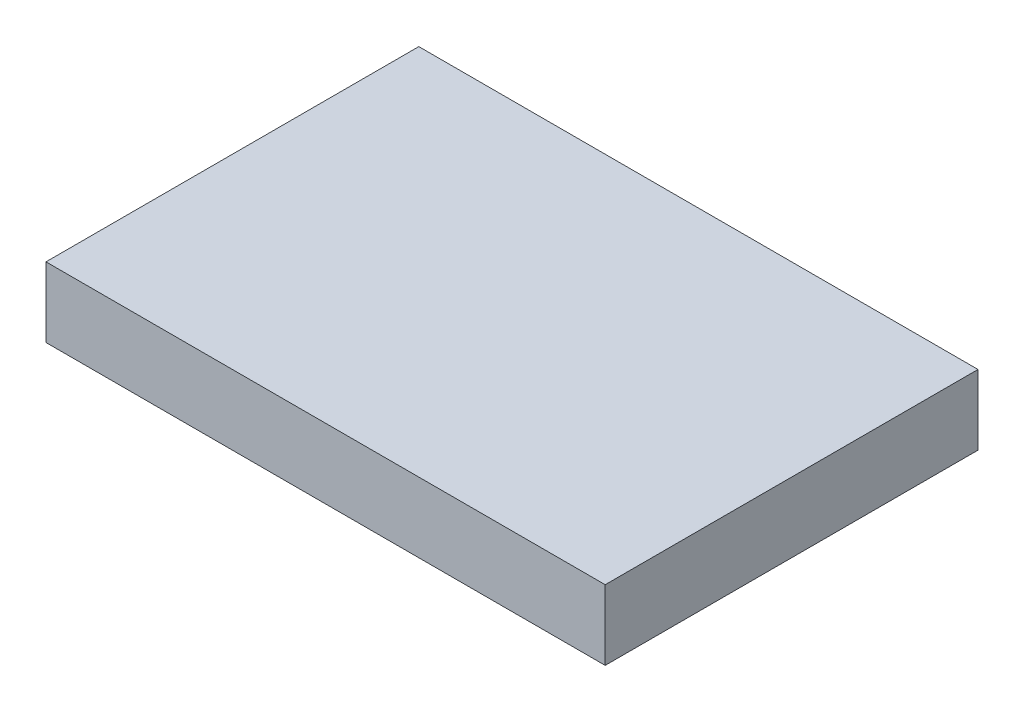
ISO-10303-21;
HEADER;
FILE_DESCRIPTION(('STEP AP214'),'2;1');
FILE_NAME('part.step','',(''),(''),'','','');
FILE_SCHEMA(('AUTOMOTIVE_DESIGN { 1 0 10303 214 1 1 1 1 }'));
ENDSEC;
DATA;
#1=APPLICATION_CONTEXT('core data for automotive mechanical design processes');
#2=APPLICATION_PROTOCOL_DEFINITION('international standard','automotive_design',2000,#1);
#3=PRODUCT_CONTEXT('',#1,'mechanical');
#4=PRODUCT('Part','Part','',(#3));
#5=PRODUCT_RELATED_PRODUCT_CATEGORY('part','',(#4));
#6=PRODUCT_DEFINITION_FORMATION('','',#4);
#7=PRODUCT_DEFINITION_CONTEXT('part definition',#1,'design');
#8=PRODUCT_DEFINITION('design','',#6,#7);
#9=PRODUCT_DEFINITION_SHAPE('','',#8);
#10=(LENGTH_UNIT() NAMED_UNIT(*) SI_UNIT(.MILLI.,.METRE.));
#11=(NAMED_UNIT(*) PLANE_ANGLE_UNIT() SI_UNIT($,.RADIAN.));
#12=(NAMED_UNIT(*) SI_UNIT($,.STERADIAN.) SOLID_ANGLE_UNIT());
#13=UNCERTAINTY_MEASURE_WITH_UNIT(LENGTH_MEASURE(1.E-05),#10,'distance_accuracy_value','');
#14=(GEOMETRIC_REPRESENTATION_CONTEXT(3) GLOBAL_UNCERTAINTY_ASSIGNED_CONTEXT((#13)) GLOBAL_UNIT_ASSIGNED_CONTEXT((#10,
#11,#12)) REPRESENTATION_CONTEXT('',''));
#15=CARTESIAN_POINT('',(0.,0.,0.));
#16=DIRECTION('',(0.,0.,1.));
#17=DIRECTION('',(1.,0.,0.));
#18=AXIS2_PLACEMENT_3D('',#15,#16,#17);
#19=CARTESIAN_POINT('',(0.,1.5,0.));
#20=DIRECTION('',(1.,0.,0.));
#21=DIRECTION('',(0.,0.,-1.));
#22=AXIS2_PLACEMENT_3D('',#19,#20,#21);
#23=PLANE('',#22);
#24=DIRECTION('',(0.,0.,1.));
#25=VECTOR('',#24,1.);
#26=CARTESIAN_POINT('',(0.,0.,0.));
#27=LINE('',#26,#25);
#28=CARTESIAN_POINT('',(0.,0.,-8.));
#29=VERTEX_POINT('',#28);
#30=CARTESIAN_POINT('',(0.,0.,0.));
#31=VERTEX_POINT('',#30);
#32=EDGE_CURVE('E96',#29,#31,#27,.T.);
#33=ORIENTED_EDGE('',*,*,#32,.T.);
#34=DIRECTION('',(0.,-1.,0.));
#35=VECTOR('',#34,1.);
#36=CARTESIAN_POINT('',(0.,1.5,0.));
#37=LINE('',#36,#35);
#38=CARTESIAN_POINT('',(0.,1.5,0.));
#39=VERTEX_POINT('',#38);
#40=EDGE_CURVE('E11',#39,#31,#37,.T.);
#41=ORIENTED_EDGE('',*,*,#40,.F.);
#42=DIRECTION('',(0.,0.,1.));
#43=VECTOR('',#42,1.);
#44=CARTESIAN_POINT('',(0.,1.5,0.));
#45=LINE('',#44,#43);
#46=CARTESIAN_POINT('',(0.,1.5,-8.));
#47=VERTEX_POINT('',#46);
#48=EDGE_CURVE('E84',#47,#39,#45,.T.);
#49=ORIENTED_EDGE('',*,*,#48,.F.);
#50=DIRECTION('',(0.,-1.,0.));
#51=VECTOR('',#50,1.);
#52=CARTESIAN_POINT('',(0.,1.5,-8.));
#53=LINE('',#52,#51);
#54=EDGE_CURVE('E92',#47,#29,#53,.T.);
#55=ORIENTED_EDGE('',*,*,#54,.T.);
#56=EDGE_LOOP('',(#33,#41,#49,#55));
#57=FACE_BOUND('',#56,.T.);
#58=ADVANCED_FACE('F33',(#57),#23,.F.);
#59=CARTESIAN_POINT('',(0.,1.5,0.));
#60=DIRECTION('',(0.,0.,-1.));
#61=DIRECTION('',(-1.,0.,0.));
#62=AXIS2_PLACEMENT_3D('',#59,#60,#61);
#63=PLANE('',#62);
#64=DIRECTION('',(1.,0.,0.));
#65=VECTOR('',#64,1.);
#66=CARTESIAN_POINT('',(0.,0.,0.));
#67=LINE('',#66,#65);
#68=CARTESIAN_POINT('',(12.,0.,0.));
#69=VERTEX_POINT('',#68);
#70=EDGE_CURVE('E88',#31,#69,#67,.T.);
#71=ORIENTED_EDGE('',*,*,#70,.T.);
#72=DIRECTION('',(0.,-1.,0.));
#73=VECTOR('',#72,1.);
#74=CARTESIAN_POINT('',(12.,1.5,0.));
#75=LINE('',#74,#73);
#76=CARTESIAN_POINT('',(12.,1.5,0.));
#77=VERTEX_POINT('',#76);
#78=EDGE_CURVE('E41',#77,#69,#75,.T.);
#79=ORIENTED_EDGE('',*,*,#78,.F.);
#80=DIRECTION('',(1.,0.,0.));
#81=VECTOR('',#80,1.);
#82=CARTESIAN_POINT('',(0.,1.5,0.));
#83=LINE('',#82,#81);
#84=EDGE_CURVE('E79',#39,#77,#83,.T.);
#85=ORIENTED_EDGE('',*,*,#84,.F.);
#86=ORIENTED_EDGE('',*,*,#40,.T.);
#87=EDGE_LOOP('',(#71,#79,#85,#86));
#88=FACE_BOUND('',#87,.T.);
#89=ADVANCED_FACE('F87',(#88),#63,.F.);
#90=CARTESIAN_POINT('',(12.,1.5,0.));
#91=DIRECTION('',(-1.,0.,0.));
#92=DIRECTION('',(0.,0.,1.));
#93=AXIS2_PLACEMENT_3D('',#90,#91,#92);
#94=PLANE('',#93);
#95=DIRECTION('',(0.,0.,-1.));
#96=VECTOR('',#95,1.);
#97=CARTESIAN_POINT('',(12.,0.,0.));
#98=LINE('',#97,#96);
#99=CARTESIAN_POINT('',(12.,0.,-8.));
#100=VERTEX_POINT('',#99);
#101=EDGE_CURVE('E66',#69,#100,#98,.T.);
#102=ORIENTED_EDGE('',*,*,#101,.T.);
#103=DIRECTION('',(0.,-1.,0.));
#104=VECTOR('',#103,1.);
#105=CARTESIAN_POINT('',(12.,1.5,-8.));
#106=LINE('',#105,#104);
#107=CARTESIAN_POINT('',(12.,1.5,-8.));
#108=VERTEX_POINT('',#107);
#109=EDGE_CURVE('E89',#108,#100,#106,.T.);
#110=ORIENTED_EDGE('',*,*,#109,.F.);
#111=DIRECTION('',(0.,0.,-1.));
#112=VECTOR('',#111,1.);
#113=CARTESIAN_POINT('',(12.,1.5,0.));
#114=LINE('',#113,#112);
#115=EDGE_CURVE('E82',#77,#108,#114,.T.);
#116=ORIENTED_EDGE('',*,*,#115,.F.);
#117=ORIENTED_EDGE('',*,*,#78,.T.);
#118=EDGE_LOOP('',(#102,#110,#116,#117));
#119=FACE_BOUND('',#118,.T.);
#120=ADVANCED_FACE('F90',(#119),#94,.F.);
#121=CARTESIAN_POINT('',(0.,1.5,-8.));
#122=DIRECTION('',(0.,0.,1.));
#123=DIRECTION('',(1.,0.,0.));
#124=AXIS2_PLACEMENT_3D('',#121,#122,#123);
#125=PLANE('',#124);
#126=DIRECTION('',(-1.,0.,0.));
#127=VECTOR('',#126,1.);
#128=CARTESIAN_POINT('',(0.,0.,-8.));
#129=LINE('',#128,#127);
#130=EDGE_CURVE('E72',#100,#29,#129,.T.);
#131=ORIENTED_EDGE('',*,*,#130,.T.);
#132=ORIENTED_EDGE('',*,*,#54,.F.);
#133=DIRECTION('',(-1.,0.,0.));
#134=VECTOR('',#133,1.);
#135=CARTESIAN_POINT('',(0.,1.5,-8.));
#136=LINE('',#135,#134);
#137=EDGE_CURVE('E49',#108,#47,#136,.T.);
#138=ORIENTED_EDGE('',*,*,#137,.F.);
#139=ORIENTED_EDGE('',*,*,#109,.T.);
#140=EDGE_LOOP('',(#131,#132,#138,#139));
#141=FACE_BOUND('',#140,.T.);
#142=ADVANCED_FACE('F103',(#141),#125,.F.);
#143=CARTESIAN_POINT('',(0.,1.5,0.));
#144=DIRECTION('',(0.,-1.,0.));
#145=DIRECTION('',(0.,0.,-1.));
#146=AXIS2_PLACEMENT_3D('',#143,#144,#145);
#147=PLANE('',#146);
#148=ORIENTED_EDGE('',*,*,#48,.T.);
#149=ORIENTED_EDGE('',*,*,#84,.T.);
#150=ORIENTED_EDGE('',*,*,#115,.T.);
#151=ORIENTED_EDGE('',*,*,#137,.T.);
#152=EDGE_LOOP('',(#148,#149,#150,#151));
#153=FACE_BOUND('',#152,.T.);
#154=ADVANCED_FACE('F80',(#153),#147,.F.);
#155=CARTESIAN_POINT('',(0.,0.,0.));
#156=DIRECTION('',(0.,-1.,0.));
#157=DIRECTION('',(0.,0.,-1.));
#158=AXIS2_PLACEMENT_3D('',#155,#156,#157);
#159=PLANE('',#158);
#160=ORIENTED_EDGE('',*,*,#32,.F.);
#161=ORIENTED_EDGE('',*,*,#130,.F.);
#162=ORIENTED_EDGE('',*,*,#101,.F.);
#163=ORIENTED_EDGE('',*,*,#70,.F.);
#164=EDGE_LOOP('',(#160,#161,#162,#163));
#165=FACE_BOUND('',#164,.T.);
#166=ADVANCED_FACE('F106',(#165),#159,.T.);
#167=CLOSED_SHELL('',(#58,#89,#120,#142,#154,#166));
#168=MANIFOLD_SOLID_BREP('B2',#167);
#169=ADVANCED_BREP_SHAPE_REPRESENTATION('',(#18,#168),#14);
#170=SHAPE_DEFINITION_REPRESENTATION(#9,#169);
ENDSEC;
END-ISO-10303-21;
